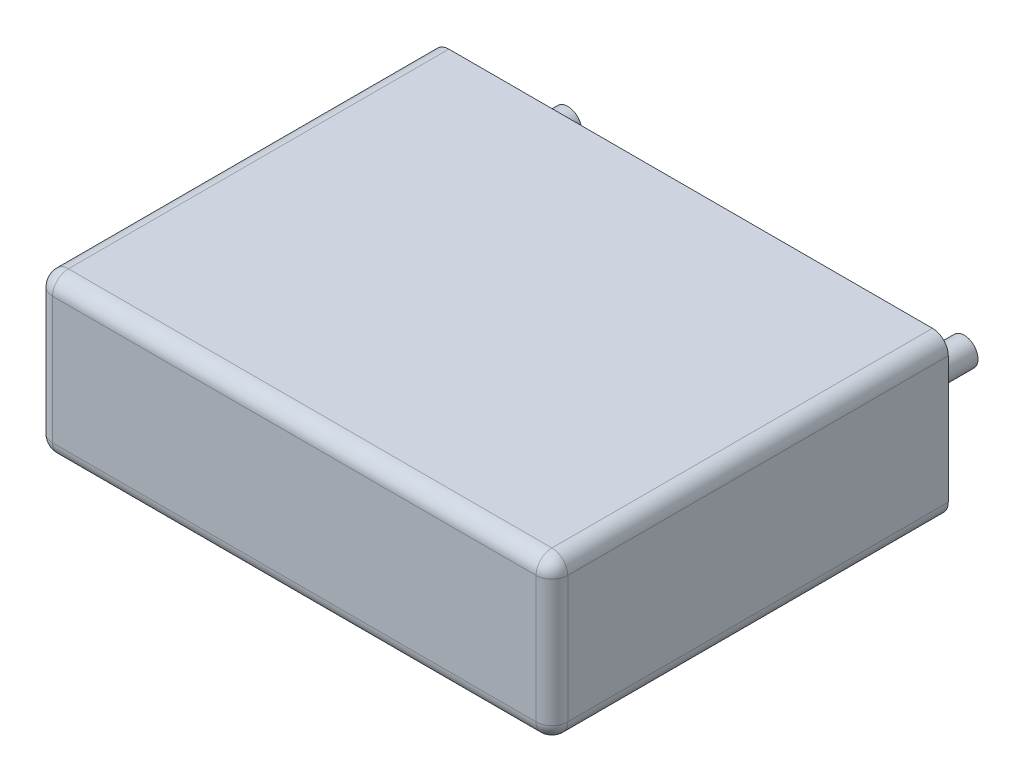
ISO-10303-21;
HEADER;
FILE_DESCRIPTION(('STEP AP214'),'2;1');
FILE_NAME('part.step','',(''),(''),'','','');
FILE_SCHEMA(('AUTOMOTIVE_DESIGN { 1 0 10303 214 1 1 1 1 }'));
ENDSEC;
DATA;
#1=APPLICATION_CONTEXT('core data for automotive mechanical design processes');
#2=APPLICATION_PROTOCOL_DEFINITION('international standard','automotive_design',2000,#1);
#3=PRODUCT_CONTEXT('',#1,'mechanical');
#4=PRODUCT('Part','Part','',(#3));
#5=PRODUCT_RELATED_PRODUCT_CATEGORY('part','',(#4));
#6=PRODUCT_DEFINITION_FORMATION('','',#4);
#7=PRODUCT_DEFINITION_CONTEXT('part definition',#1,'design');
#8=PRODUCT_DEFINITION('design','',#6,#7);
#9=PRODUCT_DEFINITION_SHAPE('','',#8);
#10=(LENGTH_UNIT() NAMED_UNIT(*) SI_UNIT(.MILLI.,.METRE.));
#11=(NAMED_UNIT(*) PLANE_ANGLE_UNIT() SI_UNIT($,.RADIAN.));
#12=(NAMED_UNIT(*) SI_UNIT($,.STERADIAN.) SOLID_ANGLE_UNIT());
#13=UNCERTAINTY_MEASURE_WITH_UNIT(LENGTH_MEASURE(1.E-05),#10,'distance_accuracy_value','');
#14=(GEOMETRIC_REPRESENTATION_CONTEXT(3) GLOBAL_UNCERTAINTY_ASSIGNED_CONTEXT((#13)) GLOBAL_UNIT_ASSIGNED_CONTEXT((#10,
#11,#12)) REPRESENTATION_CONTEXT('',''));
#15=CARTESIAN_POINT('',(0.,0.,0.));
#16=DIRECTION('',(0.,0.,1.));
#17=DIRECTION('',(1.,0.,0.));
#18=AXIS2_PLACEMENT_3D('',#15,#16,#17);
#19=CARTESIAN_POINT('',(-1.1,1.6,9.6));
#20=DIRECTION('',(0.,1.,0.));
#21=DIRECTION('',(1.,0.,0.));
#22=AXIS2_PLACEMENT_3D('',#19,#20,#21);
#23=SPHERICAL_SURFACE('',#22,0.4);
#24=CARTESIAN_POINT('',(-1.1,1.6,9.6));
#25=DIRECTION('',(0.,-1.,0.));
#26=DIRECTION('',(0.,0.,-1.));
#27=AXIS2_PLACEMENT_3D('',#24,#25,#26);
#28=CIRCLE('',#27,0.4);
#29=CARTESIAN_POINT('',(-1.1,1.6,10.));
#30=VERTEX_POINT('',#29);
#31=CARTESIAN_POINT('',(-1.5,1.6,9.6));
#32=VERTEX_POINT('',#31);
#33=EDGE_CURVE('E234',#30,#32,#28,.T.);
#34=ORIENTED_EDGE('',*,*,#33,.F.);
#35=CARTESIAN_POINT('',(-1.1,1.6,9.6));
#36=DIRECTION('',(-1.,0.,0.));
#37=DIRECTION('',(0.,0.,1.));
#38=AXIS2_PLACEMENT_3D('',#35,#36,#37);
#39=CIRCLE('',#38,0.4);
#40=CARTESIAN_POINT('',(-1.1,2.,9.6));
#41=VERTEX_POINT('',#40);
#42=EDGE_CURVE('E221',#41,#30,#39,.F.);
#43=ORIENTED_EDGE('',*,*,#42,.F.);
#44=CARTESIAN_POINT('',(-1.1,1.6,9.6));
#45=DIRECTION('',(0.,0.,1.));
#46=DIRECTION('',(1.,0.,0.));
#47=AXIS2_PLACEMENT_3D('',#44,#45,#46);
#48=CIRCLE('',#47,0.4);
#49=EDGE_CURVE('E74',#32,#41,#48,.F.);
#50=ORIENTED_EDGE('',*,*,#49,.F.);
#51=EDGE_LOOP('',(#34,#43,#50));
#52=FACE_BOUND('',#51,.T.);
#53=ADVANCED_FACE('F17',(#52),#23,.T.);
#54=CARTESIAN_POINT('',(11.1,1.6,9.6));
#55=DIRECTION('',(1.,0.,0.));
#56=DIRECTION('',(0.,-1.,0.));
#57=AXIS2_PLACEMENT_3D('',#54,#55,#56);
#58=SPHERICAL_SURFACE('',#57,0.4);
#59=CARTESIAN_POINT('',(11.1,1.6,9.6));
#60=DIRECTION('',(-1.,0.,0.));
#61=DIRECTION('',(0.,0.,1.));
#62=AXIS2_PLACEMENT_3D('',#59,#60,#61);
#63=CIRCLE('',#62,0.4);
#64=CARTESIAN_POINT('',(11.1,1.6,10.));
#65=VERTEX_POINT('',#64);
#66=CARTESIAN_POINT('',(11.1,2.,9.6));
#67=VERTEX_POINT('',#66);
#68=EDGE_CURVE('E73',#65,#67,#63,.T.);
#69=ORIENTED_EDGE('',*,*,#68,.F.);
#70=CARTESIAN_POINT('',(11.1,1.6,9.6));
#71=DIRECTION('',(0.,1.,0.));
#72=DIRECTION('',(0.,0.,1.));
#73=AXIS2_PLACEMENT_3D('',#70,#71,#72);
#74=CIRCLE('',#73,0.4);
#75=CARTESIAN_POINT('',(11.5,1.6,9.6));
#76=VERTEX_POINT('',#75);
#77=EDGE_CURVE('E229',#76,#65,#74,.F.);
#78=ORIENTED_EDGE('',*,*,#77,.F.);
#79=CARTESIAN_POINT('',(11.1,1.6,9.6));
#80=DIRECTION('',(0.,0.,1.));
#81=DIRECTION('',(1.,0.,0.));
#82=AXIS2_PLACEMENT_3D('',#79,#80,#81);
#83=CIRCLE('',#82,0.4);
#84=EDGE_CURVE('E198',#67,#76,#83,.F.);
#85=ORIENTED_EDGE('',*,*,#84,.F.);
#86=EDGE_LOOP('',(#69,#78,#85));
#87=FACE_BOUND('',#86,.T.);
#88=ADVANCED_FACE('F248',(#87),#58,.T.);
#89=CARTESIAN_POINT('',(-1.1,1.6,9.6));
#90=DIRECTION('',(0.,-1.,0.));
#91=DIRECTION('',(0.,0.,-1.));
#92=AXIS2_PLACEMENT_3D('',#89,#90,#91);
#93=CYLINDRICAL_SURFACE('',#92,0.4);
#94=CARTESIAN_POINT('',(-1.1,-1.6,9.6));
#95=DIRECTION('',(0.,1.,0.));
#96=DIRECTION('',(-1.,0.,0.));
#97=AXIS2_PLACEMENT_3D('',#94,#95,#96);
#98=CIRCLE('',#97,0.4);
#99=CARTESIAN_POINT('',(-1.1,-1.6,10.));
#100=VERTEX_POINT('',#99);
#101=CARTESIAN_POINT('',(-1.5,-1.6,9.6));
#102=VERTEX_POINT('',#101);
#103=EDGE_CURVE('E194',#100,#102,#98,.F.);
#104=ORIENTED_EDGE('',*,*,#103,.F.);
#105=DIRECTION('',(0.,1.,0.));
#106=VECTOR('',#105,1.);
#107=CARTESIAN_POINT('',(-1.1,-2.,10.));
#108=LINE('',#107,#106);
#109=EDGE_CURVE('E201',#30,#100,#108,.F.);
#110=ORIENTED_EDGE('',*,*,#109,.F.);
#111=ORIENTED_EDGE('',*,*,#33,.T.);
#112=DIRECTION('',(0.,1.,0.));
#113=VECTOR('',#112,1.);
#114=CARTESIAN_POINT('',(-1.5,-2.,9.6));
#115=LINE('',#114,#113);
#116=EDGE_CURVE('E147',#32,#102,#115,.F.);
#117=ORIENTED_EDGE('',*,*,#116,.T.);
#118=EDGE_LOOP('',(#104,#110,#111,#117));
#119=FACE_BOUND('',#118,.T.);
#120=ADVANCED_FACE('F251',(#119),#93,.T.);
#121=CARTESIAN_POINT('',(11.1,-1.6,9.6));
#122=DIRECTION('',(0.,1.,0.));
#123=DIRECTION('',(0.,0.,1.));
#124=AXIS2_PLACEMENT_3D('',#121,#122,#123);
#125=CYLINDRICAL_SURFACE('',#124,0.4);
#126=ORIENTED_EDGE('',*,*,#77,.T.);
#127=DIRECTION('',(0.,1.,0.));
#128=VECTOR('',#127,1.);
#129=CARTESIAN_POINT('',(11.1,-2.,10.));
#130=LINE('',#129,#128);
#131=CARTESIAN_POINT('',(11.1,-1.6,10.));
#132=VERTEX_POINT('',#131);
#133=EDGE_CURVE('E197',#132,#65,#130,.T.);
#134=ORIENTED_EDGE('',*,*,#133,.F.);
#135=CARTESIAN_POINT('',(11.1,-1.6,9.6));
#136=DIRECTION('',(0.,-1.,0.));
#137=DIRECTION('',(-1.,0.,0.));
#138=AXIS2_PLACEMENT_3D('',#135,#136,#137);
#139=CIRCLE('',#138,0.399999999999999);
#140=CARTESIAN_POINT('',(11.5,-1.6,9.60000000000306));
#141=VERTEX_POINT('',#140);
#142=EDGE_CURVE('E160',#141,#132,#139,.T.);
#143=ORIENTED_EDGE('',*,*,#142,.F.);
#144=DIRECTION('',(0.,1.,0.));
#145=VECTOR('',#144,1.);
#146=CARTESIAN_POINT('',(11.5,-2.,9.6));
#147=LINE('',#146,#145);
#148=EDGE_CURVE('E85',#76,#141,#147,.F.);
#149=ORIENTED_EDGE('',*,*,#148,.F.);
#150=EDGE_LOOP('',(#126,#134,#143,#149));
#151=FACE_BOUND('',#150,.T.);
#152=ADVANCED_FACE('F255',(#151),#125,.T.);
#153=CARTESIAN_POINT('',(-1.1,1.6,0.));
#154=DIRECTION('',(0.,0.,1.));
#155=DIRECTION('',(1.,0.,0.));
#156=AXIS2_PLACEMENT_3D('',#153,#154,#155);
#157=CYLINDRICAL_SURFACE('',#156,0.4);
#158=CARTESIAN_POINT('',(-1.1,1.6,0.));
#159=DIRECTION('',(0.,0.,1.));
#160=DIRECTION('',(1.,0.,0.));
#161=AXIS2_PLACEMENT_3D('',#158,#159,#160);
#162=CIRCLE('',#161,0.4);
#163=CARTESIAN_POINT('',(-1.1,2.,0.));
#164=VERTEX_POINT('',#163);
#165=CARTESIAN_POINT('',(-1.5,1.6,0.));
#166=VERTEX_POINT('',#165);
#167=EDGE_CURVE('E21',#164,#166,#162,.T.);
#168=ORIENTED_EDGE('',*,*,#167,.T.);
#169=DIRECTION('',(0.,0.,-1.));
#170=VECTOR('',#169,1.);
#171=CARTESIAN_POINT('',(-1.5,1.6,0.));
#172=LINE('',#171,#170);
#173=EDGE_CURVE('E158',#166,#32,#172,.F.);
#174=ORIENTED_EDGE('',*,*,#173,.T.);
#175=ORIENTED_EDGE('',*,*,#49,.T.);
#176=DIRECTION('',(0.,0.,1.));
#177=VECTOR('',#176,1.);
#178=CARTESIAN_POINT('',(-1.1,2.,0.));
#179=LINE('',#178,#177);
#180=EDGE_CURVE('E77',#164,#41,#179,.T.);
#181=ORIENTED_EDGE('',*,*,#180,.F.);
#182=EDGE_LOOP('',(#168,#174,#175,#181));
#183=FACE_BOUND('',#182,.T.);
#184=ADVANCED_FACE('F78',(#183),#157,.T.);
#185=CARTESIAN_POINT('',(11.1,1.6,9.6));
#186=DIRECTION('',(-1.,0.,0.));
#187=DIRECTION('',(0.,0.,1.));
#188=AXIS2_PLACEMENT_3D('',#185,#186,#187);
#189=CYLINDRICAL_SURFACE('',#188,0.4);
#190=ORIENTED_EDGE('',*,*,#42,.T.);
#191=DIRECTION('',(1.,0.,0.));
#192=VECTOR('',#191,1.);
#193=CARTESIAN_POINT('',(-1.5,1.6,10.));
#194=LINE('',#193,#192);
#195=EDGE_CURVE('E204',#65,#30,#194,.F.);
#196=ORIENTED_EDGE('',*,*,#195,.F.);
#197=ORIENTED_EDGE('',*,*,#68,.T.);
#198=DIRECTION('',(1.,0.,0.));
#199=VECTOR('',#198,1.);
#200=CARTESIAN_POINT('',(-1.5,2.,9.6));
#201=LINE('',#200,#199);
#202=EDGE_CURVE('E84',#41,#67,#201,.T.);
#203=ORIENTED_EDGE('',*,*,#202,.F.);
#204=EDGE_LOOP('',(#190,#196,#197,#203));
#205=FACE_BOUND('',#204,.T.);
#206=ADVANCED_FACE('F262',(#205),#189,.T.);
#207=CARTESIAN_POINT('',(11.1,1.6,0.));
#208=DIRECTION('',(0.,0.,1.));
#209=DIRECTION('',(1.,0.,0.));
#210=AXIS2_PLACEMENT_3D('',#207,#208,#209);
#211=CYLINDRICAL_SURFACE('',#210,0.4);
#212=DIRECTION('',(0.,0.,1.));
#213=VECTOR('',#212,1.);
#214=CARTESIAN_POINT('',(11.1,2.,0.));
#215=LINE('',#214,#213);
#216=CARTESIAN_POINT('',(11.1,2.,0.));
#217=VERTEX_POINT('',#216);
#218=EDGE_CURVE('E90',#67,#217,#215,.F.);
#219=ORIENTED_EDGE('',*,*,#218,.F.);
#220=ORIENTED_EDGE('',*,*,#84,.T.);
#221=DIRECTION('',(0.,0.,-1.));
#222=VECTOR('',#221,1.);
#223=CARTESIAN_POINT('',(11.5,1.6,0.));
#224=LINE('',#223,#222);
#225=CARTESIAN_POINT('',(11.5,1.6,0.));
#226=VERTEX_POINT('',#225);
#227=EDGE_CURVE('E144',#226,#76,#224,.F.);
#228=ORIENTED_EDGE('',*,*,#227,.F.);
#229=CARTESIAN_POINT('',(11.1,1.6,0.));
#230=DIRECTION('',(0.,0.,1.));
#231=DIRECTION('',(1.,0.,0.));
#232=AXIS2_PLACEMENT_3D('',#229,#230,#231);
#233=CIRCLE('',#232,0.4);
#234=EDGE_CURVE('E213',#226,#217,#233,.T.);
#235=ORIENTED_EDGE('',*,*,#234,.T.);
#236=EDGE_LOOP('',(#219,#220,#228,#235));
#237=FACE_BOUND('',#236,.T.);
#238=ADVANCED_FACE('F265',(#237),#211,.T.);
#239=CARTESIAN_POINT('',(0.,0.,-1.9));
#240=DIRECTION('',(0.,0.,1.));
#241=DIRECTION('',(1.,0.,0.));
#242=AXIS2_PLACEMENT_3D('',#239,#240,#241);
#243=PLANE('',#242);
#244=CARTESIAN_POINT('',(0.,0.,-1.9));
#245=DIRECTION('',(0.,0.,1.));
#246=DIRECTION('',(1.,0.,0.));
#247=AXIS2_PLACEMENT_3D('',#244,#245,#246);
#248=CIRCLE('',#247,0.35);
#249=CARTESIAN_POINT('',(0.35,0.,-1.9));
#250=VERTEX_POINT('',#249);
#251=EDGE_CURVE('E139',#250,#250,#248,.T.);
#252=ORIENTED_EDGE('',*,*,#251,.F.);
#253=EDGE_LOOP('',(#252));
#254=FACE_BOUND('',#253,.T.);
#255=ADVANCED_FACE('F268',(#254),#243,.F.);
#256=CARTESIAN_POINT('',(10.,0.,-1.9));
#257=DIRECTION('',(0.,0.,1.));
#258=DIRECTION('',(1.,0.,0.));
#259=AXIS2_PLACEMENT_3D('',#256,#257,#258);
#260=PLANE('',#259);
#261=CARTESIAN_POINT('',(10.,0.,-1.9));
#262=DIRECTION('',(0.,0.,1.));
#263=DIRECTION('',(1.,0.,0.));
#264=AXIS2_PLACEMENT_3D('',#261,#262,#263);
#265=CIRCLE('',#264,0.35);
#266=CARTESIAN_POINT('',(10.35,0.,-1.9));
#267=VERTEX_POINT('',#266);
#268=EDGE_CURVE('E155',#267,#267,#265,.T.);
#269=ORIENTED_EDGE('',*,*,#268,.F.);
#270=EDGE_LOOP('',(#269));
#271=FACE_BOUND('',#270,.T.);
#272=ADVANCED_FACE('F186',(#271),#260,.F.);
#273=CARTESIAN_POINT('',(-1.1,-1.6,9.6));
#274=DIRECTION('',(-1.,0.,0.));
#275=DIRECTION('',(0.,1.,0.));
#276=AXIS2_PLACEMENT_3D('',#273,#274,#275);
#277=SPHERICAL_SURFACE('',#276,0.4);
#278=CARTESIAN_POINT('',(-1.1,-1.6,9.6));
#279=DIRECTION('',(1.,0.,0.));
#280=DIRECTION('',(0.,0.,-1.));
#281=AXIS2_PLACEMENT_3D('',#278,#279,#280);
#282=CIRCLE('',#281,0.4);
#283=CARTESIAN_POINT('',(-1.1,-2.,9.6));
#284=VERTEX_POINT('',#283);
#285=EDGE_CURVE('E125',#100,#284,#282,.T.);
#286=ORIENTED_EDGE('',*,*,#285,.F.);
#287=ORIENTED_EDGE('',*,*,#103,.T.);
#288=CARTESIAN_POINT('',(-1.1,-1.6,9.6));
#289=DIRECTION('',(0.,0.,1.));
#290=DIRECTION('',(1.,0.,0.));
#291=AXIS2_PLACEMENT_3D('',#288,#289,#290);
#292=CIRCLE('',#291,0.4);
#293=EDGE_CURVE('E130',#284,#102,#292,.F.);
#294=ORIENTED_EDGE('',*,*,#293,.F.);
#295=EDGE_LOOP('',(#286,#287,#294));
#296=FACE_BOUND('',#295,.T.);
#297=ADVANCED_FACE('F181',(#296),#277,.T.);
#298=CARTESIAN_POINT('',(-1.5,-2.,10.));
#299=DIRECTION('',(0.,0.,1.));
#300=DIRECTION('',(1.,0.,0.));
#301=AXIS2_PLACEMENT_3D('',#298,#299,#300);
#302=PLANE('',#301);
#303=ORIENTED_EDGE('',*,*,#195,.T.);
#304=ORIENTED_EDGE('',*,*,#109,.T.);
#305=DIRECTION('',(1.,0.,0.));
#306=VECTOR('',#305,1.);
#307=CARTESIAN_POINT('',(-1.1,-1.6,10.));
#308=LINE('',#307,#306);
#309=EDGE_CURVE('E115',#132,#100,#308,.F.);
#310=ORIENTED_EDGE('',*,*,#309,.F.);
#311=ORIENTED_EDGE('',*,*,#133,.T.);
#312=EDGE_LOOP('',(#303,#304,#310,#311));
#313=FACE_BOUND('',#312,.T.);
#314=ADVANCED_FACE('F176',(#313),#302,.T.);
#315=CARTESIAN_POINT('',(11.1,-1.6,9.6));
#316=DIRECTION('',(0.,-1.,0.));
#317=DIRECTION('',(-1.,0.,0.));
#318=AXIS2_PLACEMENT_3D('',#315,#316,#317);
#319=SPHERICAL_SURFACE('',#318,0.4);
#320=ORIENTED_EDGE('',*,*,#142,.T.);
#321=CARTESIAN_POINT('',(11.1,-1.6,9.6));
#322=DIRECTION('',(1.,0.,0.));
#323=DIRECTION('',(0.,0.,-1.));
#324=AXIS2_PLACEMENT_3D('',#321,#322,#323);
#325=CIRCLE('',#324,0.4);
#326=CARTESIAN_POINT('',(11.1,-2.,9.6));
#327=VERTEX_POINT('',#326);
#328=EDGE_CURVE('E122',#327,#132,#325,.F.);
#329=ORIENTED_EDGE('',*,*,#328,.F.);
#330=CARTESIAN_POINT('',(11.1,-1.6,9.6));
#331=DIRECTION('',(0.,0.,1.));
#332=DIRECTION('',(1.,0.,0.));
#333=AXIS2_PLACEMENT_3D('',#330,#331,#332);
#334=CIRCLE('',#333,0.4);
#335=EDGE_CURVE('E113',#141,#327,#334,.F.);
#336=ORIENTED_EDGE('',*,*,#335,.F.);
#337=EDGE_LOOP('',(#320,#329,#336));
#338=FACE_BOUND('',#337,.T.);
#339=ADVANCED_FACE('F171',(#338),#319,.T.);
#340=CARTESIAN_POINT('',(-1.5,-2.,0.));
#341=DIRECTION('',(1.,0.,0.));
#342=DIRECTION('',(0.,0.,-1.));
#343=AXIS2_PLACEMENT_3D('',#340,#341,#342);
#344=PLANE('',#343);
#345=ORIENTED_EDGE('',*,*,#173,.F.);
#346=DIRECTION('',(0.,1.,0.));
#347=VECTOR('',#346,1.);
#348=CARTESIAN_POINT('',(-1.5,-2.,0.));
#349=LINE('',#348,#347);
#350=CARTESIAN_POINT('',(-1.5,-1.6,0.));
#351=VERTEX_POINT('',#350);
#352=EDGE_CURVE('E69',#166,#351,#349,.F.);
#353=ORIENTED_EDGE('',*,*,#352,.T.);
#354=DIRECTION('',(0.,0.,1.));
#355=VECTOR('',#354,1.);
#356=CARTESIAN_POINT('',(-1.5,-1.6,0.));
#357=LINE('',#356,#355);
#358=EDGE_CURVE('E135',#102,#351,#357,.F.);
#359=ORIENTED_EDGE('',*,*,#358,.F.);
#360=ORIENTED_EDGE('',*,*,#116,.F.);
#361=EDGE_LOOP('',(#345,#353,#359,#360));
#362=FACE_BOUND('',#361,.T.);
#363=ADVANCED_FACE('F175',(#362),#344,.F.);
#364=CARTESIAN_POINT('',(11.5,-2.,0.));
#365=DIRECTION('',(1.,0.,0.));
#366=DIRECTION('',(0.,0.,-1.));
#367=AXIS2_PLACEMENT_3D('',#364,#365,#366);
#368=PLANE('',#367);
#369=ORIENTED_EDGE('',*,*,#227,.T.);
#370=ORIENTED_EDGE('',*,*,#148,.T.);
#371=DIRECTION('',(0.,0.,1.));
#372=VECTOR('',#371,1.);
#373=CARTESIAN_POINT('',(11.5,-1.6,0.));
#374=LINE('',#373,#372);
#375=CARTESIAN_POINT('',(11.5,-1.6,0.));
#376=VERTEX_POINT('',#375);
#377=EDGE_CURVE('E102',#376,#141,#374,.T.);
#378=ORIENTED_EDGE('',*,*,#377,.F.);
#379=DIRECTION('',(0.,1.,0.));
#380=VECTOR('',#379,1.);
#381=CARTESIAN_POINT('',(11.5,-2.,0.));
#382=LINE('',#381,#380);
#383=EDGE_CURVE('E92',#376,#226,#382,.T.);
#384=ORIENTED_EDGE('',*,*,#383,.T.);
#385=EDGE_LOOP('',(#369,#370,#378,#384));
#386=FACE_BOUND('',#385,.T.);
#387=ADVANCED_FACE('F310',(#386),#368,.T.);
#388=CARTESIAN_POINT('',(-1.5,2.,0.));
#389=DIRECTION('',(0.,1.,0.));
#390=DIRECTION('',(0.,0.,1.));
#391=AXIS2_PLACEMENT_3D('',#388,#389,#390);
#392=PLANE('',#391);
#393=ORIENTED_EDGE('',*,*,#218,.T.);
#394=DIRECTION('',(1.,0.,0.));
#395=VECTOR('',#394,1.);
#396=CARTESIAN_POINT('',(-1.5,2.,0.));
#397=LINE('',#396,#395);
#398=EDGE_CURVE('E66',#217,#164,#397,.F.);
#399=ORIENTED_EDGE('',*,*,#398,.T.);
#400=ORIENTED_EDGE('',*,*,#180,.T.);
#401=ORIENTED_EDGE('',*,*,#202,.T.);
#402=EDGE_LOOP('',(#393,#399,#400,#401));
#403=FACE_BOUND('',#402,.T.);
#404=ADVANCED_FACE('F88',(#403),#392,.T.);
#405=CARTESIAN_POINT('',(0.,0.,0.1));
#406=DIRECTION('',(0.,0.,1.));
#407=DIRECTION('',(1.,0.,0.));
#408=AXIS2_PLACEMENT_3D('',#405,#406,#407);
#409=CYLINDRICAL_SURFACE('',#408,0.35);
#410=ORIENTED_EDGE('',*,*,#251,.T.);
#411=EDGE_LOOP('',(#410));
#412=FACE_BOUND('',#411,.T.);
#413=CARTESIAN_POINT('',(0.,0.,0.));
#414=DIRECTION('',(0.,0.,1.));
#415=DIRECTION('',(1.,0.,0.));
#416=AXIS2_PLACEMENT_3D('',#413,#414,#415);
#417=CIRCLE('',#416,0.35);
#418=CARTESIAN_POINT('',(0.35,0.,0.));
#419=VERTEX_POINT('',#418);
#420=EDGE_CURVE('E91',#419,#419,#417,.F.);
#421=ORIENTED_EDGE('',*,*,#420,.T.);
#422=EDGE_LOOP('',(#421));
#423=FACE_BOUND('',#422,.T.);
#424=ADVANCED_FACE('F304',(#412,#423),#409,.T.);
#425=CARTESIAN_POINT('',(10.,0.,0.1));
#426=DIRECTION('',(0.,0.,1.));
#427=DIRECTION('',(1.,0.,0.));
#428=AXIS2_PLACEMENT_3D('',#425,#426,#427);
#429=CYLINDRICAL_SURFACE('',#428,0.35);
#430=ORIENTED_EDGE('',*,*,#268,.T.);
#431=EDGE_LOOP('',(#430));
#432=FACE_BOUND('',#431,.T.);
#433=CARTESIAN_POINT('',(10.,0.,0.));
#434=DIRECTION('',(0.,0.,1.));
#435=DIRECTION('',(1.,0.,0.));
#436=AXIS2_PLACEMENT_3D('',#433,#434,#435);
#437=CIRCLE('',#436,0.35);
#438=CARTESIAN_POINT('',(10.35,0.,0.));
#439=VERTEX_POINT('',#438);
#440=EDGE_CURVE('E95',#439,#439,#437,.F.);
#441=ORIENTED_EDGE('',*,*,#440,.T.);
#442=EDGE_LOOP('',(#441));
#443=FACE_BOUND('',#442,.T.);
#444=ADVANCED_FACE('F300',(#432,#443),#429,.T.);
#445=CARTESIAN_POINT('',(-1.1,-1.6,0.));
#446=DIRECTION('',(0.,0.,1.));
#447=DIRECTION('',(1.,0.,0.));
#448=AXIS2_PLACEMENT_3D('',#445,#446,#447);
#449=CYLINDRICAL_SURFACE('',#448,0.4);
#450=DIRECTION('',(0.,0.,1.));
#451=VECTOR('',#450,1.);
#452=CARTESIAN_POINT('',(-1.1,-2.,0.));
#453=LINE('',#452,#451);
#454=CARTESIAN_POINT('',(-1.1,-2.,0.));
#455=VERTEX_POINT('',#454);
#456=EDGE_CURVE('E108',#455,#284,#453,.T.);
#457=ORIENTED_EDGE('',*,*,#456,.T.);
#458=ORIENTED_EDGE('',*,*,#293,.T.);
#459=ORIENTED_EDGE('',*,*,#358,.T.);
#460=CARTESIAN_POINT('',(-1.1,-1.6,0.));
#461=DIRECTION('',(0.,0.,1.));
#462=DIRECTION('',(1.,0.,0.));
#463=AXIS2_PLACEMENT_3D('',#460,#461,#462);
#464=CIRCLE('',#463,0.4);
#465=EDGE_CURVE('E101',#351,#455,#464,.T.);
#466=ORIENTED_EDGE('',*,*,#465,.T.);
#467=EDGE_LOOP('',(#457,#458,#459,#466));
#468=FACE_BOUND('',#467,.T.);
#469=ADVANCED_FACE('F296',(#468),#449,.T.);
#470=CARTESIAN_POINT('',(-1.1,-1.6,9.6));
#471=DIRECTION('',(1.,0.,0.));
#472=DIRECTION('',(0.,0.,-1.));
#473=AXIS2_PLACEMENT_3D('',#470,#471,#472);
#474=CYLINDRICAL_SURFACE('',#473,0.4);
#475=ORIENTED_EDGE('',*,*,#328,.T.);
#476=ORIENTED_EDGE('',*,*,#309,.T.);
#477=ORIENTED_EDGE('',*,*,#285,.T.);
#478=DIRECTION('',(1.,0.,0.));
#479=VECTOR('',#478,1.);
#480=CARTESIAN_POINT('',(-1.5,-2.,9.6));
#481=LINE('',#480,#479);
#482=EDGE_CURVE('E105',#284,#327,#481,.T.);
#483=ORIENTED_EDGE('',*,*,#482,.T.);
#484=EDGE_LOOP('',(#475,#476,#477,#483));
#485=FACE_BOUND('',#484,.T.);
#486=ADVANCED_FACE('F292',(#485),#474,.T.);
#487=CARTESIAN_POINT('',(11.1,-1.6,0.));
#488=DIRECTION('',(0.,0.,1.));
#489=DIRECTION('',(1.,0.,0.));
#490=AXIS2_PLACEMENT_3D('',#487,#488,#489);
#491=CYLINDRICAL_SURFACE('',#490,0.4);
#492=CARTESIAN_POINT('',(11.1,-1.6,0.));
#493=DIRECTION('',(0.,0.,1.));
#494=DIRECTION('',(1.,0.,0.));
#495=AXIS2_PLACEMENT_3D('',#492,#493,#494);
#496=CIRCLE('',#495,0.4);
#497=CARTESIAN_POINT('',(11.1,-2.,0.));
#498=VERTEX_POINT('',#497);
#499=EDGE_CURVE('E35',#498,#376,#496,.T.);
#500=ORIENTED_EDGE('',*,*,#499,.T.);
#501=ORIENTED_EDGE('',*,*,#377,.T.);
#502=ORIENTED_EDGE('',*,*,#335,.T.);
#503=DIRECTION('',(0.,0.,1.));
#504=VECTOR('',#503,1.);
#505=CARTESIAN_POINT('',(11.1,-2.,0.));
#506=LINE('',#505,#504);
#507=EDGE_CURVE('E27',#327,#498,#506,.F.);
#508=ORIENTED_EDGE('',*,*,#507,.T.);
#509=EDGE_LOOP('',(#500,#501,#502,#508));
#510=FACE_BOUND('',#509,.T.);
#511=ADVANCED_FACE('F285',(#510),#491,.T.);
#512=CARTESIAN_POINT('',(-1.5,-2.,0.));
#513=DIRECTION('',(0.,0.,1.));
#514=DIRECTION('',(1.,0.,0.));
#515=AXIS2_PLACEMENT_3D('',#512,#513,#514);
#516=PLANE('',#515);
#517=ORIENTED_EDGE('',*,*,#440,.F.);
#518=EDGE_LOOP('',(#517));
#519=FACE_BOUND('',#518,.T.);
#520=ORIENTED_EDGE('',*,*,#420,.F.);
#521=EDGE_LOOP('',(#520));
#522=FACE_BOUND('',#521,.T.);
#523=ORIENTED_EDGE('',*,*,#398,.F.);
#524=ORIENTED_EDGE('',*,*,#234,.F.);
#525=ORIENTED_EDGE('',*,*,#383,.F.);
#526=ORIENTED_EDGE('',*,*,#499,.F.);
#527=DIRECTION('',(1.,0.,0.));
#528=VECTOR('',#527,1.);
#529=CARTESIAN_POINT('',(-1.5,-2.,0.));
#530=LINE('',#529,#528);
#531=EDGE_CURVE('E11',#498,#455,#530,.F.);
#532=ORIENTED_EDGE('',*,*,#531,.T.);
#533=ORIENTED_EDGE('',*,*,#465,.F.);
#534=ORIENTED_EDGE('',*,*,#352,.F.);
#535=ORIENTED_EDGE('',*,*,#167,.F.);
#536=EDGE_LOOP('',(#523,#524,#525,#526,#532,#533,#534,#535));
#537=FACE_BOUND('',#536,.T.);
#538=ADVANCED_FACE('F64',(#519,#522,#537),#516,.F.);
#539=CARTESIAN_POINT('',(-1.5,-2.,0.));
#540=DIRECTION('',(0.,1.,0.));
#541=DIRECTION('',(0.,0.,1.));
#542=AXIS2_PLACEMENT_3D('',#539,#540,#541);
#543=PLANE('',#542);
#544=ORIENTED_EDGE('',*,*,#507,.F.);
#545=ORIENTED_EDGE('',*,*,#482,.F.);
#546=ORIENTED_EDGE('',*,*,#456,.F.);
#547=ORIENTED_EDGE('',*,*,#531,.F.);
#548=EDGE_LOOP('',(#544,#545,#546,#547));
#549=FACE_BOUND('',#548,.T.);
#550=ADVANCED_FACE('F278',(#549),#543,.F.);
#551=CLOSED_SHELL('',(#53,#88,#120,#152,#184,#206,#238,#255,#272,#297,#314,#339,#363,#387,#404,
#424,#444,#469,#486,#511,#538,#550));
#552=MANIFOLD_SOLID_BREP('B1',#551);
#553=ADVANCED_BREP_SHAPE_REPRESENTATION('',(#18,#552),#14);
#554=SHAPE_DEFINITION_REPRESENTATION(#9,#553);
ENDSEC;
END-ISO-10303-21;
